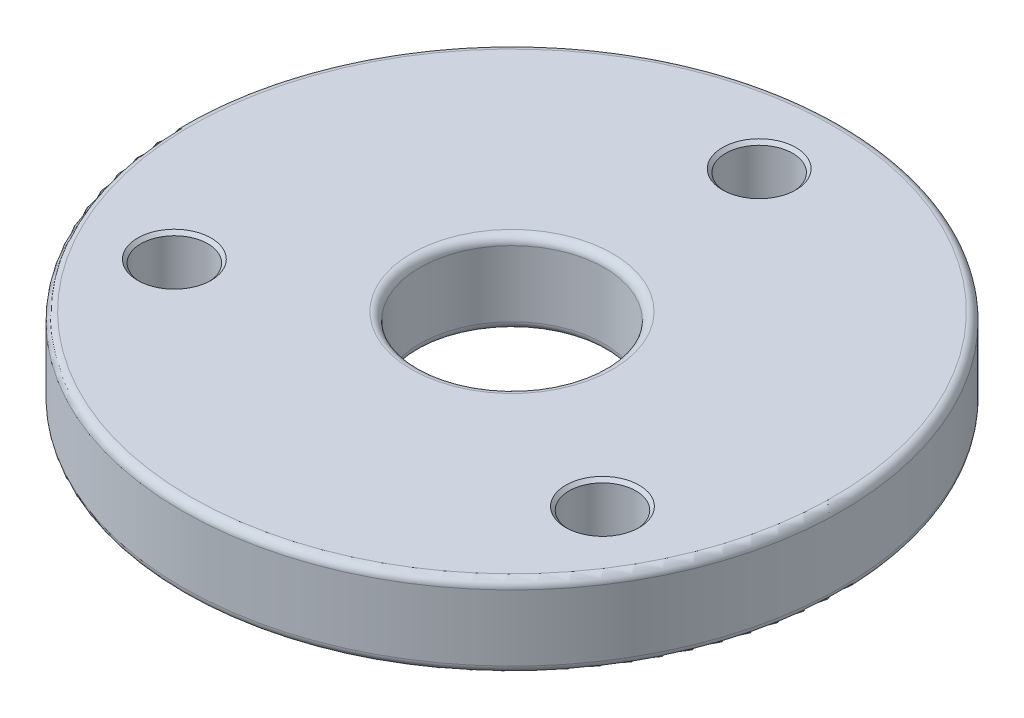
ISO-10303-21;
HEADER;
FILE_DESCRIPTION(('STEP AP214'),'2;1');
FILE_NAME('part.step','',(''),(''),'','','');
FILE_SCHEMA(('AUTOMOTIVE_DESIGN { 1 0 10303 214 1 1 1 1 }'));
ENDSEC;
DATA;
#1=APPLICATION_CONTEXT('core data for automotive mechanical design processes');
#2=APPLICATION_PROTOCOL_DEFINITION('international standard','automotive_design',2000,#1);
#3=PRODUCT_CONTEXT('',#1,'mechanical');
#4=PRODUCT('Part','Part','',(#3));
#5=PRODUCT_RELATED_PRODUCT_CATEGORY('part','',(#4));
#6=PRODUCT_DEFINITION_FORMATION('','',#4);
#7=PRODUCT_DEFINITION_CONTEXT('part definition',#1,'design');
#8=PRODUCT_DEFINITION('design','',#6,#7);
#9=PRODUCT_DEFINITION_SHAPE('','',#8);
#10=(LENGTH_UNIT() NAMED_UNIT(*) SI_UNIT(.MILLI.,.METRE.));
#11=(NAMED_UNIT(*) PLANE_ANGLE_UNIT() SI_UNIT($,.RADIAN.));
#12=(NAMED_UNIT(*) SI_UNIT($,.STERADIAN.) SOLID_ANGLE_UNIT());
#13=UNCERTAINTY_MEASURE_WITH_UNIT(LENGTH_MEASURE(1.E-05),#10,'distance_accuracy_value','');
#14=(GEOMETRIC_REPRESENTATION_CONTEXT(3) GLOBAL_UNCERTAINTY_ASSIGNED_CONTEXT((#13)) GLOBAL_UNIT_ASSIGNED_CONTEXT((#10,
#11,#12)) REPRESENTATION_CONTEXT('',''));
#15=CARTESIAN_POINT('',(0.,0.,0.));
#16=DIRECTION('',(0.,0.,1.));
#17=DIRECTION('',(1.,0.,0.));
#18=AXIS2_PLACEMENT_3D('',#15,#16,#17);
#19=CARTESIAN_POINT('',(0.,12.5,0.));
#20=DIRECTION('',(0.,1.,0.));
#21=DIRECTION('',(0.,0.,1.));
#22=AXIS2_PLACEMENT_3D('',#19,#20,#21);
#23=PLANE('',#22);
#24=CARTESIAN_POINT('',(64.9519052838329,12.5,37.5));
#25=DIRECTION('',(0.,1.,0.));
#26=DIRECTION('',(0.,0.,1.));
#27=AXIS2_PLACEMENT_3D('',#24,#25,#26);
#28=CIRCLE('',#27,11.1500000000004);
#29=CARTESIAN_POINT('',(64.9519052838329,12.5,48.6500000000003));
#30=VERTEX_POINT('',#29);
#31=EDGE_CURVE('E69',#30,#30,#28,.F.);
#32=ORIENTED_EDGE('',*,*,#31,.T.);
#33=EDGE_LOOP('',(#32));
#34=FACE_BOUND('',#33,.T.);
#35=CARTESIAN_POINT('',(0.,12.5,-75.));
#36=DIRECTION('',(0.,1.,0.));
#37=DIRECTION('',(0.,0.,1.));
#38=AXIS2_PLACEMENT_3D('',#35,#36,#37);
#39=CIRCLE('',#38,11.15);
#40=CARTESIAN_POINT('',(0.,12.5,-63.85));
#41=VERTEX_POINT('',#40);
#42=EDGE_CURVE('E73',#41,#41,#39,.F.);
#43=ORIENTED_EDGE('',*,*,#42,.T.);
#44=EDGE_LOOP('',(#43));
#45=FACE_BOUND('',#44,.T.);
#46=CARTESIAN_POINT('',(-64.9519052838329,12.5,37.5));
#47=DIRECTION('',(0.,1.,0.));
#48=DIRECTION('',(0.,0.,1.));
#49=AXIS2_PLACEMENT_3D('',#46,#47,#48);
#50=CIRCLE('',#49,11.1500000000007);
#51=CARTESIAN_POINT('',(-64.9519052838329,12.5,48.6500000000008));
#52=VERTEX_POINT('',#51);
#53=EDGE_CURVE('E77',#52,#52,#50,.F.);
#54=ORIENTED_EDGE('',*,*,#53,.T.);
#55=EDGE_LOOP('',(#54));
#56=FACE_BOUND('',#55,.T.);
#57=CARTESIAN_POINT('',(0.,12.5,0.));
#58=DIRECTION('',(0.,1.,0.));
#59=DIRECTION('',(0.,0.,1.));
#60=AXIS2_PLACEMENT_3D('',#57,#58,#59);
#61=CIRCLE('',#60,30.5);
#62=CARTESIAN_POINT('',(0.,12.5,30.5));
#63=VERTEX_POINT('',#62);
#64=EDGE_CURVE('E109',#63,#63,#61,.F.);
#65=ORIENTED_EDGE('',*,*,#64,.T.);
#66=EDGE_LOOP('',(#65));
#67=FACE_BOUND('',#66,.T.);
#68=CARTESIAN_POINT('',(0.,12.5,0.));
#69=DIRECTION('',(0.,1.,0.));
#70=DIRECTION('',(0.,0.,1.));
#71=AXIS2_PLACEMENT_3D('',#68,#69,#70);
#72=CIRCLE('',#71,97.5);
#73=CARTESIAN_POINT('',(0.,12.5,97.5));
#74=VERTEX_POINT('',#73);
#75=EDGE_CURVE('E113',#74,#74,#72,.T.);
#76=ORIENTED_EDGE('',*,*,#75,.T.);
#77=EDGE_LOOP('',(#76));
#78=FACE_BOUND('',#77,.T.);
#79=ADVANCED_FACE('F44',(#34,#45,#56,#67,#78),#23,.T.);
#80=CARTESIAN_POINT('',(0.,-12.5,0.));
#81=DIRECTION('',(0.,1.,0.));
#82=DIRECTION('',(0.,0.,1.));
#83=AXIS2_PLACEMENT_3D('',#80,#81,#82);
#84=PLANE('',#83);
#85=CARTESIAN_POINT('',(64.9519052838329,-12.5,37.5));
#86=DIRECTION('',(0.,1.,0.));
#87=DIRECTION('',(0.,0.,1.));
#88=AXIS2_PLACEMENT_3D('',#85,#86,#87);
#89=CIRCLE('',#88,11.1500000000004);
#90=CARTESIAN_POINT('',(64.9519052838329,-12.5,48.6500000000004));
#91=VERTEX_POINT('',#90);
#92=EDGE_CURVE('E89',#91,#91,#89,.T.);
#93=ORIENTED_EDGE('',*,*,#92,.T.);
#94=EDGE_LOOP('',(#93));
#95=FACE_BOUND('',#94,.T.);
#96=CARTESIAN_POINT('',(0.,-12.5,-75.));
#97=DIRECTION('',(0.,1.,0.));
#98=DIRECTION('',(0.,0.,1.));
#99=AXIS2_PLACEMENT_3D('',#96,#97,#98);
#100=CIRCLE('',#99,11.1499999999999);
#101=CARTESIAN_POINT('',(0.,-12.5,-63.8500000000001));
#102=VERTEX_POINT('',#101);
#103=EDGE_CURVE('E93',#102,#102,#100,.T.);
#104=ORIENTED_EDGE('',*,*,#103,.T.);
#105=EDGE_LOOP('',(#104));
#106=FACE_BOUND('',#105,.T.);
#107=CARTESIAN_POINT('',(-64.9519052838329,-12.5,37.5));
#108=DIRECTION('',(0.,1.,0.));
#109=DIRECTION('',(0.,0.,1.));
#110=AXIS2_PLACEMENT_3D('',#107,#108,#109);
#111=CIRCLE('',#110,11.1500000000007);
#112=CARTESIAN_POINT('',(-64.9519052838329,-12.5,48.6500000000007));
#113=VERTEX_POINT('',#112);
#114=EDGE_CURVE('E97',#113,#113,#111,.T.);
#115=ORIENTED_EDGE('',*,*,#114,.T.);
#116=EDGE_LOOP('',(#115));
#117=FACE_BOUND('',#116,.T.);
#118=CARTESIAN_POINT('',(0.,-12.5,0.));
#119=DIRECTION('',(0.,1.,0.));
#120=DIRECTION('',(0.,0.,1.));
#121=AXIS2_PLACEMENT_3D('',#118,#119,#120);
#122=CIRCLE('',#121,30.5);
#123=CARTESIAN_POINT('',(0.,-12.5,30.5));
#124=VERTEX_POINT('',#123);
#125=EDGE_CURVE('E125',#124,#124,#122,.T.);
#126=ORIENTED_EDGE('',*,*,#125,.T.);
#127=EDGE_LOOP('',(#126));
#128=FACE_BOUND('',#127,.T.);
#129=CARTESIAN_POINT('',(0.,-12.5,0.));
#130=DIRECTION('',(0.,1.,0.));
#131=DIRECTION('',(0.,0.,1.));
#132=AXIS2_PLACEMENT_3D('',#129,#130,#131);
#133=CIRCLE('',#132,97.5);
#134=CARTESIAN_POINT('',(0.,-12.5,97.5));
#135=VERTEX_POINT('',#134);
#136=EDGE_CURVE('E129',#135,#135,#133,.F.);
#137=ORIENTED_EDGE('',*,*,#136,.T.);
#138=EDGE_LOOP('',(#137));
#139=FACE_BOUND('',#138,.T.);
#140=ADVANCED_FACE('F134',(#95,#106,#117,#128,#139),#84,.F.);
#141=CARTESIAN_POINT('',(0.,12.5,0.));
#142=DIRECTION('',(0.,-1.,0.));
#143=DIRECTION('',(0.,0.,-1.));
#144=AXIS2_PLACEMENT_3D('',#141,#142,#143);
#145=CYLINDRICAL_SURFACE('',#144,100.);
#146=CARTESIAN_POINT('',(0.,-10.,0.));
#147=DIRECTION('',(0.,1.,0.));
#148=DIRECTION('',(0.,0.,1.));
#149=AXIS2_PLACEMENT_3D('',#146,#147,#148);
#150=CIRCLE('',#149,100.);
#151=CARTESIAN_POINT('',(0.,-10.,100.));
#152=VERTEX_POINT('',#151);
#153=EDGE_CURVE('E101',#152,#152,#150,.T.);
#154=ORIENTED_EDGE('',*,*,#153,.T.);
#155=EDGE_LOOP('',(#154));
#156=FACE_BOUND('',#155,.T.);
#157=CARTESIAN_POINT('',(0.,10.,0.));
#158=DIRECTION('',(0.,1.,0.));
#159=DIRECTION('',(0.,0.,1.));
#160=AXIS2_PLACEMENT_3D('',#157,#158,#159);
#161=CIRCLE('',#160,100.);
#162=CARTESIAN_POINT('',(0.,10.,100.));
#163=VERTEX_POINT('',#162);
#164=EDGE_CURVE('E105',#163,#163,#161,.F.);
#165=ORIENTED_EDGE('',*,*,#164,.T.);
#166=EDGE_LOOP('',(#165));
#167=FACE_BOUND('',#166,.T.);
#168=ADVANCED_FACE('F144',(#156,#167),#145,.T.);
#169=CARTESIAN_POINT('',(0.,12.5,0.));
#170=DIRECTION('',(0.,-1.,0.));
#171=DIRECTION('',(0.,0.,-1.));
#172=AXIS2_PLACEMENT_3D('',#169,#170,#171);
#173=CYLINDRICAL_SURFACE('',#172,28.);
#174=CARTESIAN_POINT('',(0.,-10.,0.));
#175=DIRECTION('',(0.,1.,0.));
#176=DIRECTION('',(0.,0.,1.));
#177=AXIS2_PLACEMENT_3D('',#174,#175,#176);
#178=CIRCLE('',#177,28.);
#179=CARTESIAN_POINT('',(0.,-10.,28.));
#180=VERTEX_POINT('',#179);
#181=EDGE_CURVE('E117',#180,#180,#178,.F.);
#182=ORIENTED_EDGE('',*,*,#181,.T.);
#183=EDGE_LOOP('',(#182));
#184=FACE_BOUND('',#183,.T.);
#185=CARTESIAN_POINT('',(0.,10.,0.));
#186=DIRECTION('',(0.,1.,0.));
#187=DIRECTION('',(0.,0.,1.));
#188=AXIS2_PLACEMENT_3D('',#185,#186,#187);
#189=CIRCLE('',#188,28.);
#190=CARTESIAN_POINT('',(0.,10.,28.));
#191=VERTEX_POINT('',#190);
#192=EDGE_CURVE('E121',#191,#191,#189,.T.);
#193=ORIENTED_EDGE('',*,*,#192,.T.);
#194=EDGE_LOOP('',(#193));
#195=FACE_BOUND('',#194,.T.);
#196=ADVANCED_FACE('F147',(#184,#195),#173,.F.);
#197=CARTESIAN_POINT('',(0.,12.5,-75.));
#198=DIRECTION('',(0.,-1.,0.));
#199=DIRECTION('',(0.,0.,-1.));
#200=AXIS2_PLACEMENT_3D('',#197,#198,#199);
#201=CYLINDRICAL_SURFACE('',#200,10.15);
#202=CARTESIAN_POINT('',(0.,-11.5000000000001,-75.));
#203=DIRECTION('',(0.,1.,0.));
#204=DIRECTION('',(0.,0.,1.));
#205=AXIS2_PLACEMENT_3D('',#202,#203,#204);
#206=CIRCLE('',#205,10.15);
#207=CARTESIAN_POINT('',(0.,-11.5000000000001,-64.85));
#208=VERTEX_POINT('',#207);
#209=EDGE_CURVE('E58',#208,#208,#206,.F.);
#210=ORIENTED_EDGE('',*,*,#209,.T.);
#211=EDGE_LOOP('',(#210));
#212=FACE_BOUND('',#211,.T.);
#213=CARTESIAN_POINT('',(0.,11.5,-75.));
#214=DIRECTION('',(0.,1.,0.));
#215=DIRECTION('',(0.,0.,1.));
#216=AXIS2_PLACEMENT_3D('',#213,#214,#215);
#217=CIRCLE('',#216,10.15);
#218=CARTESIAN_POINT('',(0.,11.5,-64.85));
#219=VERTEX_POINT('',#218);
#220=EDGE_CURVE('E63',#219,#219,#217,.T.);
#221=ORIENTED_EDGE('',*,*,#220,.T.);
#222=EDGE_LOOP('',(#221));
#223=FACE_BOUND('',#222,.T.);
#224=ADVANCED_FACE('F230',(#212,#223),#201,.F.);
#225=CARTESIAN_POINT('',(64.9519052838329,12.5,37.5));
#226=DIRECTION('',(0.,-1.,0.));
#227=DIRECTION('',(0.,0.,-1.));
#228=AXIS2_PLACEMENT_3D('',#225,#226,#227);
#229=CYLINDRICAL_SURFACE('',#228,10.1500000000004);
#230=CARTESIAN_POINT('',(64.9519052838329,-11.5,37.5));
#231=DIRECTION('',(0.,1.,0.));
#232=DIRECTION('',(0.,0.,1.));
#233=AXIS2_PLACEMENT_3D('',#230,#231,#232);
#234=CIRCLE('',#233,10.1500000000004);
#235=CARTESIAN_POINT('',(64.9519052838329,-11.5,47.6500000000003));
#236=VERTEX_POINT('',#235);
#237=EDGE_CURVE('E81',#236,#236,#234,.F.);
#238=ORIENTED_EDGE('',*,*,#237,.T.);
#239=EDGE_LOOP('',(#238));
#240=FACE_BOUND('',#239,.T.);
#241=CARTESIAN_POINT('',(64.9519052838329,11.5,37.5));
#242=DIRECTION('',(0.,1.,0.));
#243=DIRECTION('',(0.,0.,1.));
#244=AXIS2_PLACEMENT_3D('',#241,#242,#243);
#245=CIRCLE('',#244,10.1500000000004);
#246=CARTESIAN_POINT('',(64.9519052838329,11.5,47.6500000000003));
#247=VERTEX_POINT('',#246);
#248=EDGE_CURVE('E85',#247,#247,#245,.T.);
#249=ORIENTED_EDGE('',*,*,#248,.T.);
#250=EDGE_LOOP('',(#249));
#251=FACE_BOUND('',#250,.T.);
#252=ADVANCED_FACE('F235',(#240,#251),#229,.F.);
#253=CARTESIAN_POINT('',(-64.9519052838329,12.5,37.5));
#254=DIRECTION('',(0.,-1.,0.));
#255=DIRECTION('',(0.,0.,-1.));
#256=AXIS2_PLACEMENT_3D('',#253,#254,#255);
#257=CYLINDRICAL_SURFACE('',#256,10.1500000000007);
#258=CARTESIAN_POINT('',(-64.9519052838329,-11.5,37.5));
#259=DIRECTION('',(0.,1.,0.));
#260=DIRECTION('',(0.,0.,1.));
#261=AXIS2_PLACEMENT_3D('',#258,#259,#260);
#262=CIRCLE('',#261,10.1500000000007);
#263=CARTESIAN_POINT('',(-64.9519052838329,-11.5,47.6500000000007));
#264=VERTEX_POINT('',#263);
#265=EDGE_CURVE('E10',#264,#264,#262,.F.);
#266=ORIENTED_EDGE('',*,*,#265,.T.);
#267=EDGE_LOOP('',(#266));
#268=FACE_BOUND('',#267,.T.);
#269=CARTESIAN_POINT('',(-64.9519052838329,11.5,37.5));
#270=DIRECTION('',(0.,1.,0.));
#271=DIRECTION('',(0.,0.,1.));
#272=AXIS2_PLACEMENT_3D('',#269,#270,#271);
#273=CIRCLE('',#272,10.1500000000007);
#274=CARTESIAN_POINT('',(-64.9519052838329,11.5,47.6500000000007));
#275=VERTEX_POINT('',#274);
#276=EDGE_CURVE('E53',#275,#275,#273,.T.);
#277=ORIENTED_EDGE('',*,*,#276,.T.);
#278=EDGE_LOOP('',(#277));
#279=FACE_BOUND('',#278,.T.);
#280=ADVANCED_FACE('F172',(#268,#279),#257,.F.);
#281=CARTESIAN_POINT('',(0.,-10.,0.));
#282=DIRECTION('',(0.,1.,0.));
#283=DIRECTION('',(0.,0.,1.));
#284=AXIS2_PLACEMENT_3D('',#281,#282,#283);
#285=TOROIDAL_SURFACE('',#284,30.5,2.5);
#286=ORIENTED_EDGE('',*,*,#181,.F.);
#287=EDGE_LOOP('',(#286));
#288=FACE_BOUND('',#287,.T.);
#289=ORIENTED_EDGE('',*,*,#125,.F.);
#290=EDGE_LOOP('',(#289));
#291=FACE_BOUND('',#290,.T.);
#292=ADVANCED_FACE('F169',(#288,#291),#285,.T.);
#293=CARTESIAN_POINT('',(0.,10.,0.));
#294=DIRECTION('',(0.,1.,0.));
#295=DIRECTION('',(0.,0.,1.));
#296=AXIS2_PLACEMENT_3D('',#293,#294,#295);
#297=TOROIDAL_SURFACE('',#296,30.5,2.5);
#298=ORIENTED_EDGE('',*,*,#64,.F.);
#299=EDGE_LOOP('',(#298));
#300=FACE_BOUND('',#299,.T.);
#301=ORIENTED_EDGE('',*,*,#192,.F.);
#302=EDGE_LOOP('',(#301));
#303=FACE_BOUND('',#302,.T.);
#304=ADVANCED_FACE('F140',(#300,#303),#297,.T.);
#305=CARTESIAN_POINT('',(0.,-10.,0.));
#306=DIRECTION('',(0.,1.,0.));
#307=DIRECTION('',(0.,0.,1.));
#308=AXIS2_PLACEMENT_3D('',#305,#306,#307);
#309=TOROIDAL_SURFACE('',#308,97.5,2.5);
#310=ORIENTED_EDGE('',*,*,#136,.F.);
#311=EDGE_LOOP('',(#310));
#312=FACE_BOUND('',#311,.T.);
#313=ORIENTED_EDGE('',*,*,#153,.F.);
#314=EDGE_LOOP('',(#313));
#315=FACE_BOUND('',#314,.T.);
#316=ADVANCED_FACE('F136',(#312,#315),#309,.T.);
#317=CARTESIAN_POINT('',(0.,10.,0.));
#318=DIRECTION('',(0.,1.,0.));
#319=DIRECTION('',(0.,0.,1.));
#320=AXIS2_PLACEMENT_3D('',#317,#318,#319);
#321=TOROIDAL_SURFACE('',#320,97.5,2.5);
#322=ORIENTED_EDGE('',*,*,#164,.F.);
#323=EDGE_LOOP('',(#322));
#324=FACE_BOUND('',#323,.T.);
#325=ORIENTED_EDGE('',*,*,#75,.F.);
#326=EDGE_LOOP('',(#325));
#327=FACE_BOUND('',#326,.T.);
#328=ADVANCED_FACE('F139',(#324,#327),#321,.T.);
#329=CARTESIAN_POINT('',(64.9519052838329,-12.5,37.5));
#330=DIRECTION('',(0.,-1.,0.));
#331=DIRECTION('',(0.,0.,-1.));
#332=AXIS2_PLACEMENT_3D('',#329,#330,#331);
#333=CONICAL_SURFACE('',#332,11.1500000000004,0.785398163397452);
#334=ORIENTED_EDGE('',*,*,#237,.F.);
#335=EDGE_LOOP('',(#334));
#336=FACE_BOUND('',#335,.T.);
#337=ORIENTED_EDGE('',*,*,#92,.F.);
#338=EDGE_LOOP('',(#337));
#339=FACE_BOUND('',#338,.T.);
#340=ADVANCED_FACE('F153',(#336,#339),#333,.F.);
#341=CARTESIAN_POINT('',(64.9519052838329,11.5,37.5));
#342=DIRECTION('',(0.,1.,0.));
#343=DIRECTION('',(0.,0.,1.));
#344=AXIS2_PLACEMENT_3D('',#341,#342,#343);
#345=CONICAL_SURFACE('',#344,10.1500000000004,0.785398163397458);
#346=ORIENTED_EDGE('',*,*,#31,.F.);
#347=EDGE_LOOP('',(#346));
#348=FACE_BOUND('',#347,.T.);
#349=ORIENTED_EDGE('',*,*,#248,.F.);
#350=EDGE_LOOP('',(#349));
#351=FACE_BOUND('',#350,.T.);
#352=ADVANCED_FACE('F183',(#348,#351),#345,.F.);
#353=CARTESIAN_POINT('',(0.,-12.5,-75.));
#354=DIRECTION('',(0.,-1.,0.));
#355=DIRECTION('',(0.,0.,-1.));
#356=AXIS2_PLACEMENT_3D('',#353,#354,#355);
#357=CONICAL_SURFACE('',#356,11.1499999999999,0.785398163397459);
#358=ORIENTED_EDGE('',*,*,#209,.F.);
#359=EDGE_LOOP('',(#358));
#360=FACE_BOUND('',#359,.T.);
#361=ORIENTED_EDGE('',*,*,#103,.F.);
#362=EDGE_LOOP('',(#361));
#363=FACE_BOUND('',#362,.T.);
#364=ADVANCED_FACE('F190',(#360,#363),#357,.F.);
#365=CARTESIAN_POINT('',(0.,11.5,-75.));
#366=DIRECTION('',(0.,1.,0.));
#367=DIRECTION('',(0.,0.,1.));
#368=AXIS2_PLACEMENT_3D('',#365,#366,#367);
#369=CONICAL_SURFACE('',#368,10.15,0.785398163397445);
#370=ORIENTED_EDGE('',*,*,#42,.F.);
#371=EDGE_LOOP('',(#370));
#372=FACE_BOUND('',#371,.T.);
#373=ORIENTED_EDGE('',*,*,#220,.F.);
#374=EDGE_LOOP('',(#373));
#375=FACE_BOUND('',#374,.T.);
#376=ADVANCED_FACE('F197',(#372,#375),#369,.F.);
#377=CARTESIAN_POINT('',(-64.9519052838329,-12.5,37.5));
#378=DIRECTION('',(0.,-1.,0.));
#379=DIRECTION('',(0.,0.,-1.));
#380=AXIS2_PLACEMENT_3D('',#377,#378,#379);
#381=CONICAL_SURFACE('',#380,11.1500000000007,0.785398163397452);
#382=ORIENTED_EDGE('',*,*,#265,.F.);
#383=EDGE_LOOP('',(#382));
#384=FACE_BOUND('',#383,.T.);
#385=ORIENTED_EDGE('',*,*,#114,.F.);
#386=EDGE_LOOP('',(#385));
#387=FACE_BOUND('',#386,.T.);
#388=ADVANCED_FACE('F203',(#384,#387),#381,.F.);
#389=CARTESIAN_POINT('',(-64.9519052838329,11.5,37.5));
#390=DIRECTION('',(0.,1.,0.));
#391=DIRECTION('',(0.,0.,1.));
#392=AXIS2_PLACEMENT_3D('',#389,#390,#391);
#393=CONICAL_SURFACE('',#392,10.1500000000007,0.785398163397459);
#394=ORIENTED_EDGE('',*,*,#53,.F.);
#395=EDGE_LOOP('',(#394));
#396=FACE_BOUND('',#395,.T.);
#397=ORIENTED_EDGE('',*,*,#276,.F.);
#398=EDGE_LOOP('',(#397));
#399=FACE_BOUND('',#398,.T.);
#400=ADVANCED_FACE('F47',(#396,#399),#393,.F.);
#401=CLOSED_SHELL('',(#79,#140,#168,#196,#224,#252,#280,#292,#304,#316,#328,#340,#352,#364,#376,
#388,#400));
#402=MANIFOLD_SOLID_BREP('B2',#401);
#403=ADVANCED_BREP_SHAPE_REPRESENTATION('',(#18,#402),#14);
#404=SHAPE_DEFINITION_REPRESENTATION(#9,#403);
ENDSEC;
END-ISO-10303-21;
